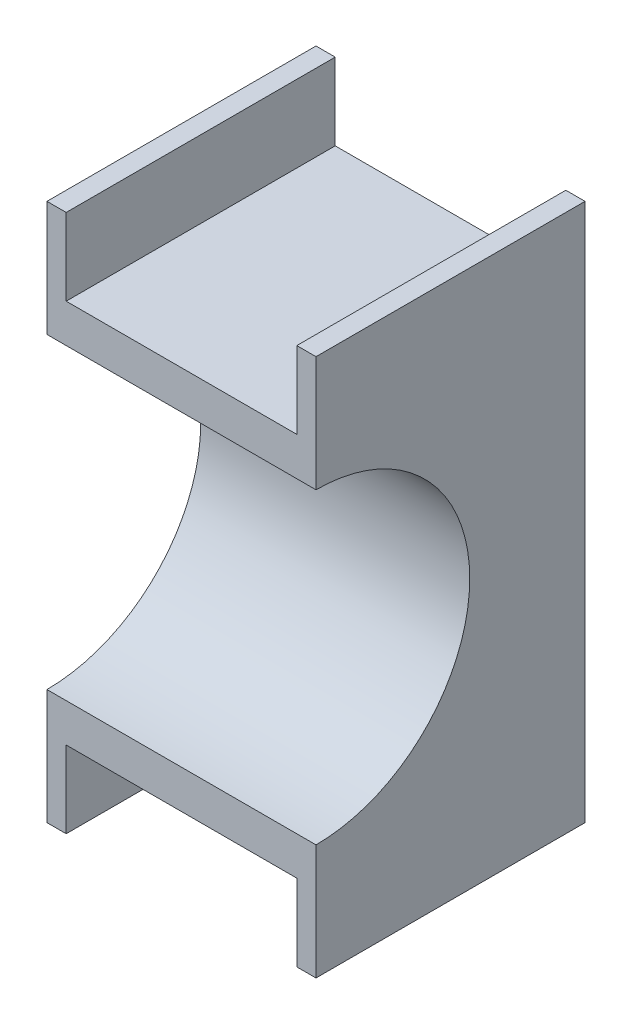
ISO-10303-21;
HEADER;
FILE_DESCRIPTION(('STEP AP214'),'2;1');
FILE_NAME('part.step','',(''),(''),'','','');
FILE_SCHEMA(('AUTOMOTIVE_DESIGN { 1 0 10303 214 1 1 1 1 }'));
ENDSEC;
DATA;
#1=APPLICATION_CONTEXT('core data for automotive mechanical design processes');
#2=APPLICATION_PROTOCOL_DEFINITION('international standard','automotive_design',2000,#1);
#3=PRODUCT_CONTEXT('',#1,'mechanical');
#4=PRODUCT('Part','Part','',(#3));
#5=PRODUCT_RELATED_PRODUCT_CATEGORY('part','',(#4));
#6=PRODUCT_DEFINITION_FORMATION('','',#4);
#7=PRODUCT_DEFINITION_CONTEXT('part definition',#1,'design');
#8=PRODUCT_DEFINITION('design','',#6,#7);
#9=PRODUCT_DEFINITION_SHAPE('','',#8);
#10=(LENGTH_UNIT() NAMED_UNIT(*) SI_UNIT(.MILLI.,.METRE.));
#11=(NAMED_UNIT(*) PLANE_ANGLE_UNIT() SI_UNIT($,.RADIAN.));
#12=(NAMED_UNIT(*) SI_UNIT($,.STERADIAN.) SOLID_ANGLE_UNIT());
#13=UNCERTAINTY_MEASURE_WITH_UNIT(LENGTH_MEASURE(1.E-05),#10,'distance_accuracy_value','');
#14=(GEOMETRIC_REPRESENTATION_CONTEXT(3) GLOBAL_UNCERTAINTY_ASSIGNED_CONTEXT((#13)) GLOBAL_UNIT_ASSIGNED_CONTEXT((#10,
#11,#12)) REPRESENTATION_CONTEXT('',''));
#15=CARTESIAN_POINT('',(0.,0.,0.));
#16=DIRECTION('',(0.,0.,1.));
#17=DIRECTION('',(1.,0.,0.));
#18=AXIS2_PLACEMENT_3D('',#15,#16,#17);
#19=CARTESIAN_POINT('',(0.,0.,3.5));
#20=DIRECTION('',(0.,0.,1.));
#21=DIRECTION('',(1.,0.,0.));
#22=AXIS2_PLACEMENT_3D('',#19,#20,#21);
#23=PLANE('',#22);
#24=DIRECTION('',(1.,0.,0.));
#25=VECTOR('',#24,1.);
#26=CARTESIAN_POINT('',(-8.,-2.,3.5));
#27=LINE('',#26,#25);
#28=CARTESIAN_POINT('',(-1.5,-2.,3.5));
#29=VERTEX_POINT('',#28);
#30=CARTESIAN_POINT('',(2.,-2.,3.5));
#31=VERTEX_POINT('',#30);
#32=EDGE_CURVE('E11',#29,#31,#27,.T.);
#33=ORIENTED_EDGE('',*,*,#32,.F.);
#34=DIRECTION('',(0.,-1.,0.));
#35=VECTOR('',#34,1.);
#36=CARTESIAN_POINT('',(-1.5,3.5,3.5));
#37=LINE('',#36,#35);
#38=CARTESIAN_POINT('',(-1.5,-3.5,3.5));
#39=VERTEX_POINT('',#38);
#40=EDGE_CURVE('E174',#29,#39,#37,.T.);
#41=ORIENTED_EDGE('',*,*,#40,.T.);
#42=DIRECTION('',(1.,0.,0.));
#43=VECTOR('',#42,1.);
#44=CARTESIAN_POINT('',(-1.5,-3.5,3.5));
#45=LINE('',#44,#43);
#46=CARTESIAN_POINT('',(-1.25,-3.5,3.5));
#47=VERTEX_POINT('',#46);
#48=EDGE_CURVE('E154',#39,#47,#45,.T.);
#49=ORIENTED_EDGE('',*,*,#48,.T.);
#50=DIRECTION('',(0.,-1.,0.));
#51=VECTOR('',#50,1.);
#52=CARTESIAN_POINT('',(-1.25,-2.5,3.5));
#53=LINE('',#52,#51);
#54=CARTESIAN_POINT('',(-1.25,-2.5,3.5));
#55=VERTEX_POINT('',#54);
#56=EDGE_CURVE('E222',#55,#47,#53,.T.);
#57=ORIENTED_EDGE('',*,*,#56,.F.);
#58=DIRECTION('',(-1.,0.,0.));
#59=VECTOR('',#58,1.);
#60=CARTESIAN_POINT('',(1.75,-2.5,3.5));
#61=LINE('',#60,#59);
#62=CARTESIAN_POINT('',(1.75,-2.5,3.5));
#63=VERTEX_POINT('',#62);
#64=EDGE_CURVE('E233',#63,#55,#61,.T.);
#65=ORIENTED_EDGE('',*,*,#64,.F.);
#66=DIRECTION('',(0.,-1.,0.));
#67=VECTOR('',#66,1.);
#68=CARTESIAN_POINT('',(1.75,-2.5,3.5));
#69=LINE('',#68,#67);
#70=CARTESIAN_POINT('',(1.75,-3.5,3.5));
#71=VERTEX_POINT('',#70);
#72=EDGE_CURVE('E212',#63,#71,#69,.T.);
#73=ORIENTED_EDGE('',*,*,#72,.T.);
#74=CARTESIAN_POINT('',(2.,-3.5,3.5));
#75=VERTEX_POINT('',#74);
#76=EDGE_CURVE('E148',#71,#75,#45,.T.);
#77=ORIENTED_EDGE('',*,*,#76,.T.);
#78=DIRECTION('',(0.,1.,0.));
#79=VECTOR('',#78,1.);
#80=CARTESIAN_POINT('',(2.,3.5,3.5));
#81=LINE('',#80,#79);
#82=EDGE_CURVE('E142',#75,#31,#81,.T.);
#83=ORIENTED_EDGE('',*,*,#82,.T.);
#84=EDGE_LOOP('',(#33,#41,#49,#57,#65,#73,#77,#83));
#85=FACE_BOUND('',#84,.T.);
#86=ADVANCED_FACE('F33',(#85),#23,.T.);
#87=CARTESIAN_POINT('',(-1.5,-3.5,3.5));
#88=DIRECTION('',(0.,1.,0.));
#89=DIRECTION('',(0.,0.,1.));
#90=AXIS2_PLACEMENT_3D('',#87,#88,#89);
#91=PLANE('',#90);
#92=DIRECTION('',(0.,0.,1.));
#93=VECTOR('',#92,1.);
#94=CARTESIAN_POINT('',(-1.25,-3.5,0.));
#95=LINE('',#94,#93);
#96=CARTESIAN_POINT('',(-1.25,-3.5,0.));
#97=VERTEX_POINT('',#96);
#98=EDGE_CURVE('E190',#97,#47,#95,.T.);
#99=ORIENTED_EDGE('',*,*,#98,.T.);
#100=ORIENTED_EDGE('',*,*,#48,.F.);
#101=DIRECTION('',(0.,0.,-1.));
#102=VECTOR('',#101,1.);
#103=CARTESIAN_POINT('',(-1.5,-3.5,3.5));
#104=LINE('',#103,#102);
#105=CARTESIAN_POINT('',(-1.5,-3.5,0.));
#106=VERTEX_POINT('',#105);
#107=EDGE_CURVE('E182',#39,#106,#104,.T.);
#108=ORIENTED_EDGE('',*,*,#107,.T.);
#109=DIRECTION('',(1.,0.,0.));
#110=VECTOR('',#109,1.);
#111=CARTESIAN_POINT('',(-1.5,-3.5,0.));
#112=LINE('',#111,#110);
#113=EDGE_CURVE('E165',#106,#97,#112,.T.);
#114=ORIENTED_EDGE('',*,*,#113,.T.);
#115=EDGE_LOOP('',(#99,#100,#108,#114));
#116=FACE_BOUND('',#115,.T.);
#117=ADVANCED_FACE('F251',(#116),#91,.F.);
#118=CARTESIAN_POINT('',(-1.5,3.5,3.5));
#119=DIRECTION('',(0.,-1.,0.));
#120=DIRECTION('',(0.,0.,-1.));
#121=AXIS2_PLACEMENT_3D('',#118,#119,#120);
#122=PLANE('',#121);
#123=DIRECTION('',(0.,0.,1.));
#124=VECTOR('',#123,1.);
#125=CARTESIAN_POINT('',(1.75,3.5,0.));
#126=LINE('',#125,#124);
#127=CARTESIAN_POINT('',(1.75,3.5,0.));
#128=VERTEX_POINT('',#127);
#129=CARTESIAN_POINT('',(1.75,3.5,3.5));
#130=VERTEX_POINT('',#129);
#131=EDGE_CURVE('E209',#128,#130,#126,.T.);
#132=ORIENTED_EDGE('',*,*,#131,.T.);
#133=DIRECTION('',(-1.,0.,0.));
#134=VECTOR('',#133,1.);
#135=CARTESIAN_POINT('',(-1.5,3.5,3.5));
#136=LINE('',#135,#134);
#137=CARTESIAN_POINT('',(2.,3.5,3.5));
#138=VERTEX_POINT('',#137);
#139=EDGE_CURVE('E152',#138,#130,#136,.T.);
#140=ORIENTED_EDGE('',*,*,#139,.F.);
#141=DIRECTION('',(0.,0.,-1.));
#142=VECTOR('',#141,1.);
#143=CARTESIAN_POINT('',(2.,3.5,3.5));
#144=LINE('',#143,#142);
#145=CARTESIAN_POINT('',(2.,3.5,0.));
#146=VERTEX_POINT('',#145);
#147=EDGE_CURVE('E177',#138,#146,#144,.T.);
#148=ORIENTED_EDGE('',*,*,#147,.T.);
#149=DIRECTION('',(-1.,0.,0.));
#150=VECTOR('',#149,1.);
#151=CARTESIAN_POINT('',(-1.5,3.5,0.));
#152=LINE('',#151,#150);
#153=EDGE_CURVE('E171',#146,#128,#152,.T.);
#154=ORIENTED_EDGE('',*,*,#153,.T.);
#155=EDGE_LOOP('',(#132,#140,#148,#154));
#156=FACE_BOUND('',#155,.T.);
#157=ADVANCED_FACE('F267',(#156),#122,.F.);
#158=CARTESIAN_POINT('',(-1.5,3.5,3.5));
#159=DIRECTION('',(1.,0.,0.));
#160=DIRECTION('',(0.,1.,0.));
#161=AXIS2_PLACEMENT_3D('',#158,#159,#160);
#162=PLANE('',#161);
#163=ORIENTED_EDGE('',*,*,#40,.F.);
#164=CARTESIAN_POINT('',(-1.5,0.,3.5));
#165=DIRECTION('',(1.,0.,0.));
#166=DIRECTION('',(0.,1.,0.));
#167=AXIS2_PLACEMENT_3D('',#164,#165,#166);
#168=CIRCLE('',#167,2.);
#169=CARTESIAN_POINT('',(-1.5,2.,3.5));
#170=VERTEX_POINT('',#169);
#171=EDGE_CURVE('E133',#29,#170,#168,.T.);
#172=ORIENTED_EDGE('',*,*,#171,.T.);
#173=CARTESIAN_POINT('',(-1.5,3.5,3.5));
#174=VERTEX_POINT('',#173);
#175=EDGE_CURVE('E188',#174,#170,#37,.T.);
#176=ORIENTED_EDGE('',*,*,#175,.F.);
#177=DIRECTION('',(0.,0.,-1.));
#178=VECTOR('',#177,1.);
#179=CARTESIAN_POINT('',(-1.5,3.5,3.5));
#180=LINE('',#179,#178);
#181=CARTESIAN_POINT('',(-1.5,3.5,0.));
#182=VERTEX_POINT('',#181);
#183=EDGE_CURVE('E159',#174,#182,#180,.T.);
#184=ORIENTED_EDGE('',*,*,#183,.T.);
#185=DIRECTION('',(0.,-1.,0.));
#186=VECTOR('',#185,1.);
#187=CARTESIAN_POINT('',(-1.5,3.5,0.));
#188=LINE('',#187,#186);
#189=EDGE_CURVE('E160',#182,#106,#188,.T.);
#190=ORIENTED_EDGE('',*,*,#189,.T.);
#191=ORIENTED_EDGE('',*,*,#107,.F.);
#192=EDGE_LOOP('',(#163,#172,#176,#184,#190,#191));
#193=FACE_BOUND('',#192,.T.);
#194=ADVANCED_FACE('F35',(#193),#162,.F.);
#195=ORIENTED_EDGE('',*,*,#76,.F.);
#196=DIRECTION('',(0.,0.,1.));
#197=VECTOR('',#196,1.);
#198=CARTESIAN_POINT('',(1.75,-3.5,0.));
#199=LINE('',#198,#197);
#200=CARTESIAN_POINT('',(1.75,-3.5,0.));
#201=VERTEX_POINT('',#200);
#202=EDGE_CURVE('E231',#201,#71,#199,.T.);
#203=ORIENTED_EDGE('',*,*,#202,.F.);
#204=CARTESIAN_POINT('',(2.,-3.5,0.));
#205=VERTEX_POINT('',#204);
#206=EDGE_CURVE('E163',#201,#205,#112,.T.);
#207=ORIENTED_EDGE('',*,*,#206,.T.);
#208=DIRECTION('',(0.,0.,-1.));
#209=VECTOR('',#208,1.);
#210=CARTESIAN_POINT('',(2.,-3.5,3.5));
#211=LINE('',#210,#209);
#212=EDGE_CURVE('E180',#75,#205,#211,.T.);
#213=ORIENTED_EDGE('',*,*,#212,.F.);
#214=EDGE_LOOP('',(#195,#203,#207,#213));
#215=FACE_BOUND('',#214,.T.);
#216=ADVANCED_FACE('F262',(#215),#91,.F.);
#217=CARTESIAN_POINT('',(2.,3.5,3.5));
#218=DIRECTION('',(-1.,0.,0.));
#219=DIRECTION('',(0.,-1.,0.));
#220=AXIS2_PLACEMENT_3D('',#217,#218,#219);
#221=PLANE('',#220);
#222=CARTESIAN_POINT('',(2.,2.,3.5));
#223=VERTEX_POINT('',#222);
#224=EDGE_CURVE('E144',#223,#138,#81,.T.);
#225=ORIENTED_EDGE('',*,*,#224,.F.);
#226=CARTESIAN_POINT('',(2.,0.,3.5));
#227=DIRECTION('',(1.,0.,0.));
#228=DIRECTION('',(0.,1.,0.));
#229=AXIS2_PLACEMENT_3D('',#226,#227,#228);
#230=CIRCLE('',#229,2.);
#231=EDGE_CURVE('E47',#31,#223,#230,.T.);
#232=ORIENTED_EDGE('',*,*,#231,.F.);
#233=ORIENTED_EDGE('',*,*,#82,.F.);
#234=ORIENTED_EDGE('',*,*,#212,.T.);
#235=DIRECTION('',(0.,1.,0.));
#236=VECTOR('',#235,1.);
#237=CARTESIAN_POINT('',(2.,3.5,0.));
#238=LINE('',#237,#236);
#239=EDGE_CURVE('E168',#205,#146,#238,.T.);
#240=ORIENTED_EDGE('',*,*,#239,.T.);
#241=ORIENTED_EDGE('',*,*,#147,.F.);
#242=EDGE_LOOP('',(#225,#232,#233,#234,#240,#241));
#243=FACE_BOUND('',#242,.T.);
#244=ADVANCED_FACE('F140',(#243),#221,.F.);
#245=CARTESIAN_POINT('',(-1.25,3.5,3.5));
#246=VERTEX_POINT('',#245);
#247=EDGE_CURVE('E150',#246,#174,#136,.T.);
#248=ORIENTED_EDGE('',*,*,#247,.F.);
#249=DIRECTION('',(0.,0.,1.));
#250=VECTOR('',#249,1.);
#251=CARTESIAN_POINT('',(-1.25,3.5,0.));
#252=LINE('',#251,#250);
#253=CARTESIAN_POINT('',(-1.25,3.5,0.));
#254=VERTEX_POINT('',#253);
#255=EDGE_CURVE('E206',#254,#246,#252,.T.);
#256=ORIENTED_EDGE('',*,*,#255,.F.);
#257=EDGE_CURVE('E170',#254,#182,#152,.T.);
#258=ORIENTED_EDGE('',*,*,#257,.T.);
#259=ORIENTED_EDGE('',*,*,#183,.F.);
#260=EDGE_LOOP('',(#248,#256,#258,#259));
#261=FACE_BOUND('',#260,.T.);
#262=ADVANCED_FACE('F281',(#261),#122,.F.);
#263=DIRECTION('',(1.,0.,0.));
#264=VECTOR('',#263,1.);
#265=CARTESIAN_POINT('',(-8.,2.,3.5));
#266=LINE('',#265,#264);
#267=EDGE_CURVE('E41',#223,#170,#266,.F.);
#268=ORIENTED_EDGE('',*,*,#267,.F.);
#269=ORIENTED_EDGE('',*,*,#224,.T.);
#270=ORIENTED_EDGE('',*,*,#139,.T.);
#271=DIRECTION('',(0.,1.,0.));
#272=VECTOR('',#271,1.);
#273=CARTESIAN_POINT('',(1.75,2.5,3.5));
#274=LINE('',#273,#272);
#275=CARTESIAN_POINT('',(1.75,2.5,3.5));
#276=VERTEX_POINT('',#275);
#277=EDGE_CURVE('E197',#276,#130,#274,.T.);
#278=ORIENTED_EDGE('',*,*,#277,.F.);
#279=DIRECTION('',(1.,0.,0.));
#280=VECTOR('',#279,1.);
#281=CARTESIAN_POINT('',(-1.25,2.5,3.5));
#282=LINE('',#281,#280);
#283=CARTESIAN_POINT('',(-1.25,2.5,3.5));
#284=VERTEX_POINT('',#283);
#285=EDGE_CURVE('E208',#284,#276,#282,.T.);
#286=ORIENTED_EDGE('',*,*,#285,.F.);
#287=DIRECTION('',(0.,1.,0.));
#288=VECTOR('',#287,1.);
#289=CARTESIAN_POINT('',(-1.25,2.5,3.5));
#290=LINE('',#289,#288);
#291=EDGE_CURVE('E164',#284,#246,#290,.T.);
#292=ORIENTED_EDGE('',*,*,#291,.T.);
#293=ORIENTED_EDGE('',*,*,#247,.T.);
#294=ORIENTED_EDGE('',*,*,#175,.T.);
#295=EDGE_LOOP('',(#268,#269,#270,#278,#286,#292,#293,#294));
#296=FACE_BOUND('',#295,.T.);
#297=ADVANCED_FACE('F192',(#296),#23,.T.);
#298=CARTESIAN_POINT('',(0.,0.,0.));
#299=DIRECTION('',(0.,0.,1.));
#300=DIRECTION('',(1.,0.,0.));
#301=AXIS2_PLACEMENT_3D('',#298,#299,#300);
#302=PLANE('',#301);
#303=ORIENTED_EDGE('',*,*,#206,.F.);
#304=DIRECTION('',(0.,-1.,0.));
#305=VECTOR('',#304,1.);
#306=CARTESIAN_POINT('',(1.75,-2.5,0.));
#307=LINE('',#306,#305);
#308=CARTESIAN_POINT('',(1.75,-2.5,0.));
#309=VERTEX_POINT('',#308);
#310=EDGE_CURVE('E228',#309,#201,#307,.T.);
#311=ORIENTED_EDGE('',*,*,#310,.F.);
#312=DIRECTION('',(-1.,0.,0.));
#313=VECTOR('',#312,1.);
#314=CARTESIAN_POINT('',(1.75,-2.5,0.));
#315=LINE('',#314,#313);
#316=CARTESIAN_POINT('',(-1.25,-2.5,0.));
#317=VERTEX_POINT('',#316);
#318=EDGE_CURVE('E238',#309,#317,#315,.T.);
#319=ORIENTED_EDGE('',*,*,#318,.T.);
#320=DIRECTION('',(0.,-1.,0.));
#321=VECTOR('',#320,1.);
#322=CARTESIAN_POINT('',(-1.25,-2.5,0.));
#323=LINE('',#322,#321);
#324=EDGE_CURVE('E224',#317,#97,#323,.T.);
#325=ORIENTED_EDGE('',*,*,#324,.T.);
#326=ORIENTED_EDGE('',*,*,#113,.F.);
#327=ORIENTED_EDGE('',*,*,#189,.F.);
#328=ORIENTED_EDGE('',*,*,#257,.F.);
#329=DIRECTION('',(0.,1.,0.));
#330=VECTOR('',#329,1.);
#331=CARTESIAN_POINT('',(-1.25,2.5,0.));
#332=LINE('',#331,#330);
#333=CARTESIAN_POINT('',(-1.25,2.5,0.));
#334=VERTEX_POINT('',#333);
#335=EDGE_CURVE('E203',#334,#254,#332,.T.);
#336=ORIENTED_EDGE('',*,*,#335,.F.);
#337=DIRECTION('',(1.,0.,0.));
#338=VECTOR('',#337,1.);
#339=CARTESIAN_POINT('',(-1.25,2.5,0.));
#340=LINE('',#339,#338);
#341=CARTESIAN_POINT('',(1.75,2.5,0.));
#342=VERTEX_POINT('',#341);
#343=EDGE_CURVE('E215',#334,#342,#340,.T.);
#344=ORIENTED_EDGE('',*,*,#343,.T.);
#345=DIRECTION('',(0.,1.,0.));
#346=VECTOR('',#345,1.);
#347=CARTESIAN_POINT('',(1.75,2.5,0.));
#348=LINE('',#347,#346);
#349=EDGE_CURVE('E199',#342,#128,#348,.T.);
#350=ORIENTED_EDGE('',*,*,#349,.T.);
#351=ORIENTED_EDGE('',*,*,#153,.F.);
#352=ORIENTED_EDGE('',*,*,#239,.F.);
#353=EDGE_LOOP('',(#303,#311,#319,#325,#326,#327,#328,#336,#344,#350,#351,#352));
#354=FACE_BOUND('',#353,.T.);
#355=ADVANCED_FACE('F255',(#354),#302,.F.);
#356=CARTESIAN_POINT('',(-1.25,2.5,0.));
#357=DIRECTION('',(-1.,0.,0.));
#358=DIRECTION('',(0.,0.,1.));
#359=AXIS2_PLACEMENT_3D('',#356,#357,#358);
#360=PLANE('',#359);
#361=ORIENTED_EDGE('',*,*,#255,.T.);
#362=ORIENTED_EDGE('',*,*,#291,.F.);
#363=DIRECTION('',(0.,0.,1.));
#364=VECTOR('',#363,1.);
#365=CARTESIAN_POINT('',(-1.25,2.5,0.));
#366=LINE('',#365,#364);
#367=EDGE_CURVE('E200',#334,#284,#366,.T.);
#368=ORIENTED_EDGE('',*,*,#367,.F.);
#369=ORIENTED_EDGE('',*,*,#335,.T.);
#370=EDGE_LOOP('',(#361,#362,#368,#369));
#371=FACE_BOUND('',#370,.T.);
#372=ADVANCED_FACE('F278',(#371),#360,.F.);
#373=CARTESIAN_POINT('',(1.75,2.5,0.));
#374=DIRECTION('',(-1.,0.,0.));
#375=DIRECTION('',(0.,0.,1.));
#376=AXIS2_PLACEMENT_3D('',#373,#374,#375);
#377=PLANE('',#376);
#378=ORIENTED_EDGE('',*,*,#131,.F.);
#379=ORIENTED_EDGE('',*,*,#349,.F.);
#380=DIRECTION('',(0.,0.,1.));
#381=VECTOR('',#380,1.);
#382=CARTESIAN_POINT('',(1.75,2.5,0.));
#383=LINE('',#382,#381);
#384=EDGE_CURVE('E218',#342,#276,#383,.T.);
#385=ORIENTED_EDGE('',*,*,#384,.T.);
#386=ORIENTED_EDGE('',*,*,#277,.T.);
#387=EDGE_LOOP('',(#378,#379,#385,#386));
#388=FACE_BOUND('',#387,.T.);
#389=ADVANCED_FACE('F272',(#388),#377,.T.);
#390=CARTESIAN_POINT('',(0.,2.5,0.));
#391=DIRECTION('',(0.,-1.,0.));
#392=DIRECTION('',(0.,0.,-1.));
#393=AXIS2_PLACEMENT_3D('',#390,#391,#392);
#394=PLANE('',#393);
#395=ORIENTED_EDGE('',*,*,#285,.T.);
#396=ORIENTED_EDGE('',*,*,#384,.F.);
#397=ORIENTED_EDGE('',*,*,#343,.F.);
#398=ORIENTED_EDGE('',*,*,#367,.T.);
#399=EDGE_LOOP('',(#395,#396,#397,#398));
#400=FACE_BOUND('',#399,.T.);
#401=ADVANCED_FACE('F274',(#400),#394,.F.);
#402=CARTESIAN_POINT('',(1.75,-2.5,0.));
#403=DIRECTION('',(1.,0.,0.));
#404=DIRECTION('',(0.,0.,-1.));
#405=AXIS2_PLACEMENT_3D('',#402,#403,#404);
#406=PLANE('',#405);
#407=ORIENTED_EDGE('',*,*,#202,.T.);
#408=ORIENTED_EDGE('',*,*,#72,.F.);
#409=DIRECTION('',(0.,0.,1.));
#410=VECTOR('',#409,1.);
#411=CARTESIAN_POINT('',(1.75,-2.5,0.));
#412=LINE('',#411,#410);
#413=EDGE_CURVE('E225',#309,#63,#412,.T.);
#414=ORIENTED_EDGE('',*,*,#413,.F.);
#415=ORIENTED_EDGE('',*,*,#310,.T.);
#416=EDGE_LOOP('',(#407,#408,#414,#415));
#417=FACE_BOUND('',#416,.T.);
#418=ADVANCED_FACE('F259',(#417),#406,.F.);
#419=CARTESIAN_POINT('',(-1.25,-2.5,0.));
#420=DIRECTION('',(1.,0.,0.));
#421=DIRECTION('',(0.,0.,-1.));
#422=AXIS2_PLACEMENT_3D('',#419,#420,#421);
#423=PLANE('',#422);
#424=ORIENTED_EDGE('',*,*,#98,.F.);
#425=ORIENTED_EDGE('',*,*,#324,.F.);
#426=DIRECTION('',(0.,0.,1.));
#427=VECTOR('',#426,1.);
#428=CARTESIAN_POINT('',(-1.25,-2.5,0.));
#429=LINE('',#428,#427);
#430=EDGE_CURVE('E55',#317,#55,#429,.T.);
#431=ORIENTED_EDGE('',*,*,#430,.T.);
#432=ORIENTED_EDGE('',*,*,#56,.T.);
#433=EDGE_LOOP('',(#424,#425,#431,#432));
#434=FACE_BOUND('',#433,.T.);
#435=ADVANCED_FACE('F249',(#434),#423,.T.);
#436=CARTESIAN_POINT('',(0.,-2.5,0.));
#437=DIRECTION('',(0.,1.,0.));
#438=DIRECTION('',(0.,0.,1.));
#439=AXIS2_PLACEMENT_3D('',#436,#437,#438);
#440=PLANE('',#439);
#441=ORIENTED_EDGE('',*,*,#64,.T.);
#442=ORIENTED_EDGE('',*,*,#430,.F.);
#443=ORIENTED_EDGE('',*,*,#318,.F.);
#444=ORIENTED_EDGE('',*,*,#413,.T.);
#445=EDGE_LOOP('',(#441,#442,#443,#444));
#446=FACE_BOUND('',#445,.T.);
#447=ADVANCED_FACE('F244',(#446),#440,.F.);
#448=CARTESIAN_POINT('',(-8.,0.,3.5));
#449=DIRECTION('',(1.,0.,0.));
#450=DIRECTION('',(0.,1.,0.));
#451=AXIS2_PLACEMENT_3D('',#448,#449,#450);
#452=CYLINDRICAL_SURFACE('',#451,2.);
#453=ORIENTED_EDGE('',*,*,#32,.T.);
#454=ORIENTED_EDGE('',*,*,#231,.T.);
#455=ORIENTED_EDGE('',*,*,#267,.T.);
#456=ORIENTED_EDGE('',*,*,#171,.F.);
#457=EDGE_LOOP('',(#453,#454,#455,#456));
#458=FACE_BOUND('',#457,.T.);
#459=ADVANCED_FACE('F131',(#458),#452,.F.);
#460=CLOSED_SHELL('',(#86,#117,#157,#194,#216,#244,#262,#297,#355,#372,#389,#401,#418,#435,#447,#459));
#461=MANIFOLD_SOLID_BREP('B2',#460);
#462=ADVANCED_BREP_SHAPE_REPRESENTATION('',(#18,#461),#14);
#463=SHAPE_DEFINITION_REPRESENTATION(#9,#462);
ENDSEC;
END-ISO-10303-21;
